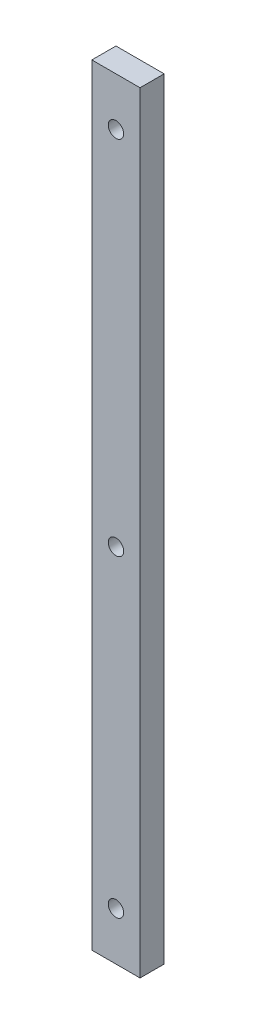
ISO-10303-21;
HEADER;
FILE_DESCRIPTION(('STEP AP214'),'2;1');
FILE_NAME('part.step','',(''),(''),'','','');
FILE_SCHEMA(('AUTOMOTIVE_DESIGN { 1 0 10303 214 1 1 1 1 }'));
ENDSEC;
DATA;
#1=APPLICATION_CONTEXT('core data for automotive mechanical design processes');
#2=APPLICATION_PROTOCOL_DEFINITION('international standard','automotive_design',2000,#1);
#3=PRODUCT_CONTEXT('',#1,'mechanical');
#4=PRODUCT('Part','Part','',(#3));
#5=PRODUCT_RELATED_PRODUCT_CATEGORY('part','',(#4));
#6=PRODUCT_DEFINITION_FORMATION('','',#4);
#7=PRODUCT_DEFINITION_CONTEXT('part definition',#1,'design');
#8=PRODUCT_DEFINITION('design','',#6,#7);
#9=PRODUCT_DEFINITION_SHAPE('','',#8);
#10=(LENGTH_UNIT() NAMED_UNIT(*) SI_UNIT(.MILLI.,.METRE.));
#11=(NAMED_UNIT(*) PLANE_ANGLE_UNIT() SI_UNIT($,.RADIAN.));
#12=(NAMED_UNIT(*) SI_UNIT($,.STERADIAN.) SOLID_ANGLE_UNIT());
#13=UNCERTAINTY_MEASURE_WITH_UNIT(LENGTH_MEASURE(1.E-05),#10,'distance_accuracy_value','');
#14=(GEOMETRIC_REPRESENTATION_CONTEXT(3) GLOBAL_UNCERTAINTY_ASSIGNED_CONTEXT((#13)) GLOBAL_UNIT_ASSIGNED_CONTEXT((#10,
#11,#12)) REPRESENTATION_CONTEXT('',''));
#15=CARTESIAN_POINT('',(0.,0.,0.));
#16=DIRECTION('',(0.,0.,1.));
#17=DIRECTION('',(1.,0.,0.));
#18=AXIS2_PLACEMENT_3D('',#15,#16,#17);
#19=CARTESIAN_POINT('',(0.,0.,5.));
#20=DIRECTION('',(0.,0.,-1.));
#21=DIRECTION('',(-1.,0.,0.));
#22=AXIS2_PLACEMENT_3D('',#19,#20,#21);
#23=PLANE('',#22);
#24=DIRECTION('',(0.,-1.,0.));
#25=VECTOR('',#24,1.);
#26=CARTESIAN_POINT('',(0.,0.,5.));
#27=LINE('',#26,#25);
#28=CARTESIAN_POINT('',(0.,160.,5.));
#29=VERTEX_POINT('',#28);
#30=CARTESIAN_POINT('',(0.,0.,5.));
#31=VERTEX_POINT('',#30);
#32=EDGE_CURVE('E85',#29,#31,#27,.T.);
#33=ORIENTED_EDGE('',*,*,#32,.T.);
#34=DIRECTION('',(1.,0.,0.));
#35=VECTOR('',#34,1.);
#36=CARTESIAN_POINT('',(0.,0.,5.));
#37=LINE('',#36,#35);
#38=CARTESIAN_POINT('',(10.,0.,5.));
#39=VERTEX_POINT('',#38);
#40=EDGE_CURVE('E80',#31,#39,#37,.T.);
#41=ORIENTED_EDGE('',*,*,#40,.T.);
#42=DIRECTION('',(0.,1.,0.));
#43=VECTOR('',#42,1.);
#44=CARTESIAN_POINT('',(10.,0.,5.));
#45=LINE('',#44,#43);
#46=CARTESIAN_POINT('',(9.99999999999997,160.,5.));
#47=VERTEX_POINT('',#46);
#48=EDGE_CURVE('E83',#39,#47,#45,.T.);
#49=ORIENTED_EDGE('',*,*,#48,.T.);
#50=DIRECTION('',(-1.,0.,0.));
#51=VECTOR('',#50,1.);
#52=CARTESIAN_POINT('',(0.,160.,5.));
#53=LINE('',#52,#51);
#54=EDGE_CURVE('E50',#47,#29,#53,.T.);
#55=ORIENTED_EDGE('',*,*,#54,.T.);
#56=EDGE_LOOP('',(#33,#41,#49,#55));
#57=FACE_BOUND('',#56,.T.);
#58=CARTESIAN_POINT('',(5.00000000000002,10.,5.));
#59=DIRECTION('',(0.,0.,1.));
#60=DIRECTION('',(1.,0.,0.));
#61=AXIS2_PLACEMENT_3D('',#58,#59,#60);
#62=CIRCLE('',#61,1.6);
#63=CARTESIAN_POINT('',(6.60000000000002,10.,5.));
#64=VERTEX_POINT('',#63);
#65=EDGE_CURVE('E100',#64,#64,#62,.T.);
#66=ORIENTED_EDGE('',*,*,#65,.F.);
#67=EDGE_LOOP('',(#66));
#68=FACE_BOUND('',#67,.T.);
#69=CARTESIAN_POINT('',(5.00000000000002,150.,5.));
#70=DIRECTION('',(0.,0.,1.));
#71=DIRECTION('',(-1.,0.,0.));
#72=AXIS2_PLACEMENT_3D('',#69,#70,#71);
#73=CIRCLE('',#72,1.59999999999999);
#74=CARTESIAN_POINT('',(3.40000000000002,150.,5.));
#75=VERTEX_POINT('',#74);
#76=EDGE_CURVE('E115',#75,#75,#73,.T.);
#77=ORIENTED_EDGE('',*,*,#76,.F.);
#78=EDGE_LOOP('',(#77));
#79=FACE_BOUND('',#78,.T.);
#80=CARTESIAN_POINT('',(5.00000000000001,75.,5.));
#81=DIRECTION('',(0.,0.,1.));
#82=DIRECTION('',(1.,0.,0.));
#83=AXIS2_PLACEMENT_3D('',#80,#81,#82);
#84=CIRCLE('',#83,1.6);
#85=CARTESIAN_POINT('',(6.60000000000001,75.,5.));
#86=VERTEX_POINT('',#85);
#87=EDGE_CURVE('E121',#86,#86,#84,.T.);
#88=ORIENTED_EDGE('',*,*,#87,.F.);
#89=EDGE_LOOP('',(#88));
#90=FACE_BOUND('',#89,.T.);
#91=ADVANCED_FACE('F33',(#57,#68,#79,#90),#23,.F.);
#92=CARTESIAN_POINT('',(0.,0.,0.));
#93=DIRECTION('',(0.,0.,-1.));
#94=DIRECTION('',(-1.,0.,0.));
#95=AXIS2_PLACEMENT_3D('',#92,#93,#94);
#96=PLANE('',#95);
#97=CARTESIAN_POINT('',(5.00000000000002,150.,0.));
#98=DIRECTION('',(0.,0.,1.));
#99=DIRECTION('',(-1.,0.,0.));
#100=AXIS2_PLACEMENT_3D('',#97,#98,#99);
#101=CIRCLE('',#100,1.59999999999999);
#102=CARTESIAN_POINT('',(3.40000000000002,150.,0.));
#103=VERTEX_POINT('',#102);
#104=EDGE_CURVE('E118',#103,#103,#101,.T.);
#105=ORIENTED_EDGE('',*,*,#104,.T.);
#106=EDGE_LOOP('',(#105));
#107=FACE_BOUND('',#106,.T.);
#108=DIRECTION('',(0.,-1.,0.));
#109=VECTOR('',#108,1.);
#110=CARTESIAN_POINT('',(0.,0.,0.));
#111=LINE('',#110,#109);
#112=CARTESIAN_POINT('',(0.,160.,0.));
#113=VERTEX_POINT('',#112);
#114=CARTESIAN_POINT('',(0.,0.,0.));
#115=VERTEX_POINT('',#114);
#116=EDGE_CURVE('E97',#113,#115,#111,.T.);
#117=ORIENTED_EDGE('',*,*,#116,.F.);
#118=DIRECTION('',(-1.,0.,0.));
#119=VECTOR('',#118,1.);
#120=CARTESIAN_POINT('',(0.,160.,0.));
#121=LINE('',#120,#119);
#122=CARTESIAN_POINT('',(9.99999999999997,160.,0.));
#123=VERTEX_POINT('',#122);
#124=EDGE_CURVE('E73',#123,#113,#121,.T.);
#125=ORIENTED_EDGE('',*,*,#124,.F.);
#126=DIRECTION('',(0.,1.,0.));
#127=VECTOR('',#126,1.);
#128=CARTESIAN_POINT('',(10.,0.,0.));
#129=LINE('',#128,#127);
#130=CARTESIAN_POINT('',(10.,0.,0.));
#131=VERTEX_POINT('',#130);
#132=EDGE_CURVE('E67',#131,#123,#129,.T.);
#133=ORIENTED_EDGE('',*,*,#132,.F.);
#134=DIRECTION('',(1.,0.,0.));
#135=VECTOR('',#134,1.);
#136=CARTESIAN_POINT('',(0.,0.,0.));
#137=LINE('',#136,#135);
#138=EDGE_CURVE('E89',#115,#131,#137,.T.);
#139=ORIENTED_EDGE('',*,*,#138,.F.);
#140=EDGE_LOOP('',(#117,#125,#133,#139));
#141=FACE_BOUND('',#140,.T.);
#142=CARTESIAN_POINT('',(5.00000000000002,10.,0.));
#143=DIRECTION('',(0.,0.,1.));
#144=DIRECTION('',(1.,0.,0.));
#145=AXIS2_PLACEMENT_3D('',#142,#143,#144);
#146=CIRCLE('',#145,1.6);
#147=CARTESIAN_POINT('',(6.60000000000002,10.,0.));
#148=VERTEX_POINT('',#147);
#149=EDGE_CURVE('E112',#148,#148,#146,.T.);
#150=ORIENTED_EDGE('',*,*,#149,.T.);
#151=EDGE_LOOP('',(#150));
#152=FACE_BOUND('',#151,.T.);
#153=CARTESIAN_POINT('',(5.00000000000001,75.,0.));
#154=DIRECTION('',(0.,0.,1.));
#155=DIRECTION('',(1.,0.,0.));
#156=AXIS2_PLACEMENT_3D('',#153,#154,#155);
#157=CIRCLE('',#156,1.6);
#158=CARTESIAN_POINT('',(6.60000000000001,75.,0.));
#159=VERTEX_POINT('',#158);
#160=EDGE_CURVE('E124',#159,#159,#157,.T.);
#161=ORIENTED_EDGE('',*,*,#160,.T.);
#162=EDGE_LOOP('',(#161));
#163=FACE_BOUND('',#162,.T.);
#164=ADVANCED_FACE('F108',(#107,#141,#152,#163),#96,.T.);
#165=CARTESIAN_POINT('',(0.,0.,5.));
#166=DIRECTION('',(1.,0.,0.));
#167=DIRECTION('',(0.,0.,-1.));
#168=AXIS2_PLACEMENT_3D('',#165,#166,#167);
#169=PLANE('',#168);
#170=ORIENTED_EDGE('',*,*,#116,.T.);
#171=DIRECTION('',(0.,0.,-1.));
#172=VECTOR('',#171,1.);
#173=CARTESIAN_POINT('',(0.,0.,5.));
#174=LINE('',#173,#172);
#175=EDGE_CURVE('E11',#31,#115,#174,.T.);
#176=ORIENTED_EDGE('',*,*,#175,.F.);
#177=ORIENTED_EDGE('',*,*,#32,.F.);
#178=DIRECTION('',(0.,0.,-1.));
#179=VECTOR('',#178,1.);
#180=CARTESIAN_POINT('',(0.,160.,5.));
#181=LINE('',#180,#179);
#182=EDGE_CURVE('E93',#29,#113,#181,.T.);
#183=ORIENTED_EDGE('',*,*,#182,.T.);
#184=EDGE_LOOP('',(#170,#176,#177,#183));
#185=FACE_BOUND('',#184,.T.);
#186=ADVANCED_FACE('F35',(#185),#169,.F.);
#187=CARTESIAN_POINT('',(0.,0.,5.));
#188=DIRECTION('',(0.,1.,0.));
#189=DIRECTION('',(0.,0.,1.));
#190=AXIS2_PLACEMENT_3D('',#187,#188,#189);
#191=PLANE('',#190);
#192=ORIENTED_EDGE('',*,*,#138,.T.);
#193=DIRECTION('',(0.,0.,-1.));
#194=VECTOR('',#193,1.);
#195=CARTESIAN_POINT('',(10.,0.,5.));
#196=LINE('',#195,#194);
#197=EDGE_CURVE('E42',#39,#131,#196,.T.);
#198=ORIENTED_EDGE('',*,*,#197,.F.);
#199=ORIENTED_EDGE('',*,*,#40,.F.);
#200=ORIENTED_EDGE('',*,*,#175,.T.);
#201=EDGE_LOOP('',(#192,#198,#199,#200));
#202=FACE_BOUND('',#201,.T.);
#203=ADVANCED_FACE('F88',(#202),#191,.F.);
#204=CARTESIAN_POINT('',(10.,0.,5.));
#205=DIRECTION('',(-1.,0.,0.));
#206=DIRECTION('',(0.,-1.,0.));
#207=AXIS2_PLACEMENT_3D('',#204,#205,#206);
#208=PLANE('',#207);
#209=ORIENTED_EDGE('',*,*,#132,.T.);
#210=DIRECTION('',(0.,0.,-1.));
#211=VECTOR('',#210,1.);
#212=CARTESIAN_POINT('',(9.99999999999997,160.,5.));
#213=LINE('',#212,#211);
#214=EDGE_CURVE('E90',#47,#123,#213,.T.);
#215=ORIENTED_EDGE('',*,*,#214,.F.);
#216=ORIENTED_EDGE('',*,*,#48,.F.);
#217=ORIENTED_EDGE('',*,*,#197,.T.);
#218=EDGE_LOOP('',(#209,#215,#216,#217));
#219=FACE_BOUND('',#218,.T.);
#220=ADVANCED_FACE('F91',(#219),#208,.F.);
#221=CARTESIAN_POINT('',(0.,160.,5.));
#222=DIRECTION('',(0.,-1.,0.));
#223=DIRECTION('',(0.,0.,-1.));
#224=AXIS2_PLACEMENT_3D('',#221,#222,#223);
#225=PLANE('',#224);
#226=ORIENTED_EDGE('',*,*,#124,.T.);
#227=ORIENTED_EDGE('',*,*,#182,.F.);
#228=ORIENTED_EDGE('',*,*,#54,.F.);
#229=ORIENTED_EDGE('',*,*,#214,.T.);
#230=EDGE_LOOP('',(#226,#227,#228,#229));
#231=FACE_BOUND('',#230,.T.);
#232=ADVANCED_FACE('F105',(#231),#225,.F.);
#233=CARTESIAN_POINT('',(5.00000000000002,10.,5.));
#234=DIRECTION('',(0.,0.,-1.));
#235=DIRECTION('',(-1.,0.,0.));
#236=AXIS2_PLACEMENT_3D('',#233,#234,#235);
#237=CYLINDRICAL_SURFACE('',#236,1.6);
#238=ORIENTED_EDGE('',*,*,#65,.T.);
#239=EDGE_LOOP('',(#238));
#240=FACE_BOUND('',#239,.T.);
#241=ORIENTED_EDGE('',*,*,#149,.F.);
#242=EDGE_LOOP('',(#241));
#243=FACE_BOUND('',#242,.T.);
#244=ADVANCED_FACE('F141',(#240,#243),#237,.F.);
#245=CARTESIAN_POINT('',(5.00000000000002,150.,5.));
#246=DIRECTION('',(0.,0.,-1.));
#247=DIRECTION('',(-1.,0.,0.));
#248=AXIS2_PLACEMENT_3D('',#245,#246,#247);
#249=CYLINDRICAL_SURFACE('',#248,1.59999999999999);
#250=ORIENTED_EDGE('',*,*,#76,.T.);
#251=EDGE_LOOP('',(#250));
#252=FACE_BOUND('',#251,.T.);
#253=ORIENTED_EDGE('',*,*,#104,.F.);
#254=EDGE_LOOP('',(#253));
#255=FACE_BOUND('',#254,.T.);
#256=ADVANCED_FACE('F187',(#252,#255),#249,.F.);
#257=CARTESIAN_POINT('',(5.00000000000001,75.,5.));
#258=DIRECTION('',(0.,0.,-1.));
#259=DIRECTION('',(-1.,0.,0.));
#260=AXIS2_PLACEMENT_3D('',#257,#258,#259);
#261=CYLINDRICAL_SURFACE('',#260,1.6);
#262=ORIENTED_EDGE('',*,*,#87,.T.);
#263=EDGE_LOOP('',(#262));
#264=FACE_BOUND('',#263,.T.);
#265=ORIENTED_EDGE('',*,*,#160,.F.);
#266=EDGE_LOOP('',(#265));
#267=FACE_BOUND('',#266,.T.);
#268=ADVANCED_FACE('F130',(#264,#267),#261,.F.);
#269=CLOSED_SHELL('',(#91,#164,#186,#203,#220,#232,#244,#256,#268));
#270=MANIFOLD_SOLID_BREP('B2',#269);
#271=ADVANCED_BREP_SHAPE_REPRESENTATION('',(#18,#270),#14);
#272=SHAPE_DEFINITION_REPRESENTATION(#9,#271);
ENDSEC;
END-ISO-10303-21;
